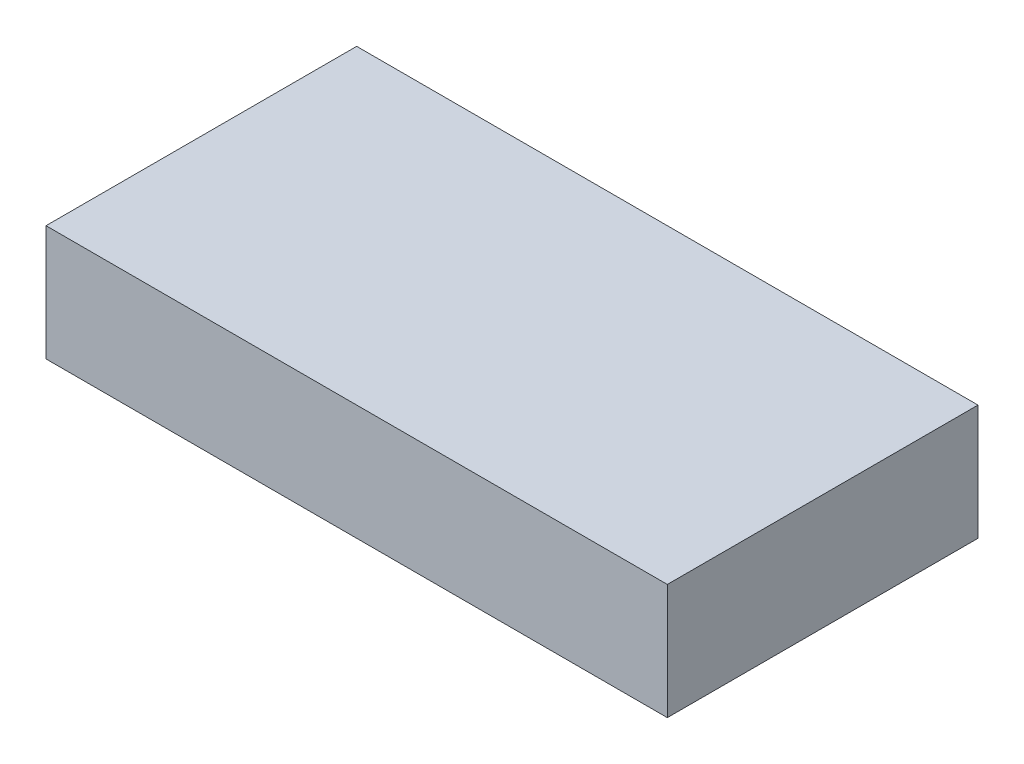
ISO-10303-21;
HEADER;
FILE_DESCRIPTION(('STEP AP214'),'2;1');
FILE_NAME('part.step','',(''),(''),'','','');
FILE_SCHEMA(('AUTOMOTIVE_DESIGN { 1 0 10303 214 1 1 1 1 }'));
ENDSEC;
DATA;
#1=APPLICATION_CONTEXT('core data for automotive mechanical design processes');
#2=APPLICATION_PROTOCOL_DEFINITION('international standard','automotive_design',2000,#1);
#3=PRODUCT_CONTEXT('',#1,'mechanical');
#4=PRODUCT('Part','Part','',(#3));
#5=PRODUCT_RELATED_PRODUCT_CATEGORY('part','',(#4));
#6=PRODUCT_DEFINITION_FORMATION('','',#4);
#7=PRODUCT_DEFINITION_CONTEXT('part definition',#1,'design');
#8=PRODUCT_DEFINITION('design','',#6,#7);
#9=PRODUCT_DEFINITION_SHAPE('','',#8);
#10=(LENGTH_UNIT() NAMED_UNIT(*) SI_UNIT(.MILLI.,.METRE.));
#11=(NAMED_UNIT(*) PLANE_ANGLE_UNIT() SI_UNIT($,.RADIAN.));
#12=(NAMED_UNIT(*) SI_UNIT($,.STERADIAN.) SOLID_ANGLE_UNIT());
#13=UNCERTAINTY_MEASURE_WITH_UNIT(LENGTH_MEASURE(1.E-05),#10,'distance_accuracy_value','');
#14=(GEOMETRIC_REPRESENTATION_CONTEXT(3) GLOBAL_UNCERTAINTY_ASSIGNED_CONTEXT((#13)) GLOBAL_UNIT_ASSIGNED_CONTEXT((#10,
#11,#12)) REPRESENTATION_CONTEXT('',''));
#15=CARTESIAN_POINT('',(0.,0.,0.));
#16=DIRECTION('',(0.,0.,1.));
#17=DIRECTION('',(1.,0.,0.));
#18=AXIS2_PLACEMENT_3D('',#15,#16,#17);
#19=CARTESIAN_POINT('',(0.,13.,0.));
#20=DIRECTION('',(-1.,0.,0.));
#21=DIRECTION('',(0.,0.,1.));
#22=AXIS2_PLACEMENT_3D('',#19,#20,#21);
#23=PLANE('',#22);
#24=DIRECTION('',(0.,0.,-1.));
#25=VECTOR('',#24,1.);
#26=CARTESIAN_POINT('',(0.,0.,0.));
#27=LINE('',#26,#25);
#28=CARTESIAN_POINT('',(0.,0.,35.));
#29=VERTEX_POINT('',#28);
#30=CARTESIAN_POINT('',(0.,0.,0.));
#31=VERTEX_POINT('',#30);
#32=EDGE_CURVE('E113',#29,#31,#27,.T.);
#33=ORIENTED_EDGE('',*,*,#32,.T.);
#34=DIRECTION('',(0.,-1.,0.));
#35=VECTOR('',#34,1.);
#36=CARTESIAN_POINT('',(0.,13.,0.));
#37=LINE('',#36,#35);
#38=CARTESIAN_POINT('',(0.,13.,0.));
#39=VERTEX_POINT('',#38);
#40=EDGE_CURVE('E11',#39,#31,#37,.T.);
#41=ORIENTED_EDGE('',*,*,#40,.F.);
#42=DIRECTION('',(0.,0.,-1.));
#43=VECTOR('',#42,1.);
#44=CARTESIAN_POINT('',(0.,13.,0.));
#45=LINE('',#44,#43);
#46=CARTESIAN_POINT('',(0.,13.,35.));
#47=VERTEX_POINT('',#46);
#48=EDGE_CURVE('E97',#47,#39,#45,.T.);
#49=ORIENTED_EDGE('',*,*,#48,.F.);
#50=DIRECTION('',(0.,-1.,0.));
#51=VECTOR('',#50,1.);
#52=CARTESIAN_POINT('',(0.,13.,35.));
#53=LINE('',#52,#51);
#54=EDGE_CURVE('E109',#47,#29,#53,.T.);
#55=ORIENTED_EDGE('',*,*,#54,.T.);
#56=EDGE_LOOP('',(#33,#41,#49,#55));
#57=FACE_BOUND('',#56,.T.);
#58=ADVANCED_FACE('F45',(#57),#23,.F.);
#59=CARTESIAN_POINT('',(0.,13.,0.));
#60=DIRECTION('',(0.,0.,1.));
#61=DIRECTION('',(1.,0.,0.));
#62=AXIS2_PLACEMENT_3D('',#59,#60,#61);
#63=PLANE('',#62);
#64=DIRECTION('',(-1.,0.,0.));
#65=VECTOR('',#64,1.);
#66=CARTESIAN_POINT('',(0.,0.,0.));
#67=LINE('',#66,#65);
#68=CARTESIAN_POINT('',(-70.,0.,0.));
#69=VERTEX_POINT('',#68);
#70=EDGE_CURVE('E102',#31,#69,#67,.T.);
#71=ORIENTED_EDGE('',*,*,#70,.T.);
#72=DIRECTION('',(0.,-1.,0.));
#73=VECTOR('',#72,1.);
#74=CARTESIAN_POINT('',(-70.,13.,0.));
#75=LINE('',#74,#73);
#76=CARTESIAN_POINT('',(-70.,13.,0.));
#77=VERTEX_POINT('',#76);
#78=EDGE_CURVE('E54',#77,#69,#75,.T.);
#79=ORIENTED_EDGE('',*,*,#78,.F.);
#80=DIRECTION('',(-1.,0.,0.));
#81=VECTOR('',#80,1.);
#82=CARTESIAN_POINT('',(0.,13.,0.));
#83=LINE('',#82,#81);
#84=EDGE_CURVE('E92',#39,#77,#83,.T.);
#85=ORIENTED_EDGE('',*,*,#84,.F.);
#86=ORIENTED_EDGE('',*,*,#40,.T.);
#87=EDGE_LOOP('',(#71,#79,#85,#86));
#88=FACE_BOUND('',#87,.T.);
#89=ADVANCED_FACE('F101',(#88),#63,.F.);
#90=CARTESIAN_POINT('',(-70.,13.,0.));
#91=DIRECTION('',(1.,0.,0.));
#92=DIRECTION('',(0.,0.,-1.));
#93=AXIS2_PLACEMENT_3D('',#90,#91,#92);
#94=PLANE('',#93);
#95=DIRECTION('',(0.,0.,1.));
#96=VECTOR('',#95,1.);
#97=CARTESIAN_POINT('',(-70.,0.,0.));
#98=LINE('',#97,#96);
#99=CARTESIAN_POINT('',(-70.,0.,35.));
#100=VERTEX_POINT('',#99);
#101=EDGE_CURVE('E79',#69,#100,#98,.T.);
#102=ORIENTED_EDGE('',*,*,#101,.T.);
#103=DIRECTION('',(0.,-1.,0.));
#104=VECTOR('',#103,1.);
#105=CARTESIAN_POINT('',(-70.,13.,35.));
#106=LINE('',#105,#104);
#107=CARTESIAN_POINT('',(-70.,13.,35.));
#108=VERTEX_POINT('',#107);
#109=EDGE_CURVE('E104',#108,#100,#106,.T.);
#110=ORIENTED_EDGE('',*,*,#109,.F.);
#111=DIRECTION('',(0.,0.,1.));
#112=VECTOR('',#111,1.);
#113=CARTESIAN_POINT('',(-70.,13.,0.));
#114=LINE('',#113,#112);
#115=EDGE_CURVE('E95',#77,#108,#114,.T.);
#116=ORIENTED_EDGE('',*,*,#115,.F.);
#117=ORIENTED_EDGE('',*,*,#78,.T.);
#118=EDGE_LOOP('',(#102,#110,#116,#117));
#119=FACE_BOUND('',#118,.T.);
#120=ADVANCED_FACE('F105',(#119),#94,.F.);
#121=CARTESIAN_POINT('',(0.,13.,35.));
#122=DIRECTION('',(0.,0.,-1.));
#123=DIRECTION('',(-1.,0.,0.));
#124=AXIS2_PLACEMENT_3D('',#121,#122,#123);
#125=PLANE('',#124);
#126=DIRECTION('',(1.,0.,0.));
#127=VECTOR('',#126,1.);
#128=CARTESIAN_POINT('',(0.,0.,35.));
#129=LINE('',#128,#127);
#130=EDGE_CURVE('E85',#100,#29,#129,.T.);
#131=ORIENTED_EDGE('',*,*,#130,.T.);
#132=ORIENTED_EDGE('',*,*,#54,.F.);
#133=DIRECTION('',(1.,0.,0.));
#134=VECTOR('',#133,1.);
#135=CARTESIAN_POINT('',(0.,13.,35.));
#136=LINE('',#135,#134);
#137=EDGE_CURVE('E62',#108,#47,#136,.T.);
#138=ORIENTED_EDGE('',*,*,#137,.F.);
#139=ORIENTED_EDGE('',*,*,#109,.T.);
#140=EDGE_LOOP('',(#131,#132,#138,#139));
#141=FACE_BOUND('',#140,.T.);
#142=ADVANCED_FACE('F126',(#141),#125,.F.);
#143=CARTESIAN_POINT('',(0.,13.,0.));
#144=DIRECTION('',(0.,-1.,0.));
#145=DIRECTION('',(0.,0.,-1.));
#146=AXIS2_PLACEMENT_3D('',#143,#144,#145);
#147=PLANE('',#146);
#148=ORIENTED_EDGE('',*,*,#48,.T.);
#149=ORIENTED_EDGE('',*,*,#84,.T.);
#150=ORIENTED_EDGE('',*,*,#115,.T.);
#151=ORIENTED_EDGE('',*,*,#137,.T.);
#152=EDGE_LOOP('',(#148,#149,#150,#151));
#153=FACE_BOUND('',#152,.T.);
#154=ADVANCED_FACE('F93',(#153),#147,.F.);
#155=CARTESIAN_POINT('',(0.,0.,0.));
#156=DIRECTION('',(0.,-1.,0.));
#157=DIRECTION('',(0.,0.,-1.));
#158=AXIS2_PLACEMENT_3D('',#155,#156,#157);
#159=PLANE('',#158);
#160=ORIENTED_EDGE('',*,*,#32,.F.);
#161=ORIENTED_EDGE('',*,*,#130,.F.);
#162=ORIENTED_EDGE('',*,*,#101,.F.);
#163=ORIENTED_EDGE('',*,*,#70,.F.);
#164=EDGE_LOOP('',(#160,#161,#162,#163));
#165=FACE_BOUND('',#164,.T.);
#166=ADVANCED_FACE('F129',(#165),#159,.T.);
#167=CLOSED_SHELL('',(#58,#89,#120,#142,#154,#166));
#168=MANIFOLD_SOLID_BREP('B2',#167);
#169=ADVANCED_BREP_SHAPE_REPRESENTATION('',(#18,#168),#14);
#170=SHAPE_DEFINITION_REPRESENTATION(#9,#169);
ENDSEC;
END-ISO-10303-21;
